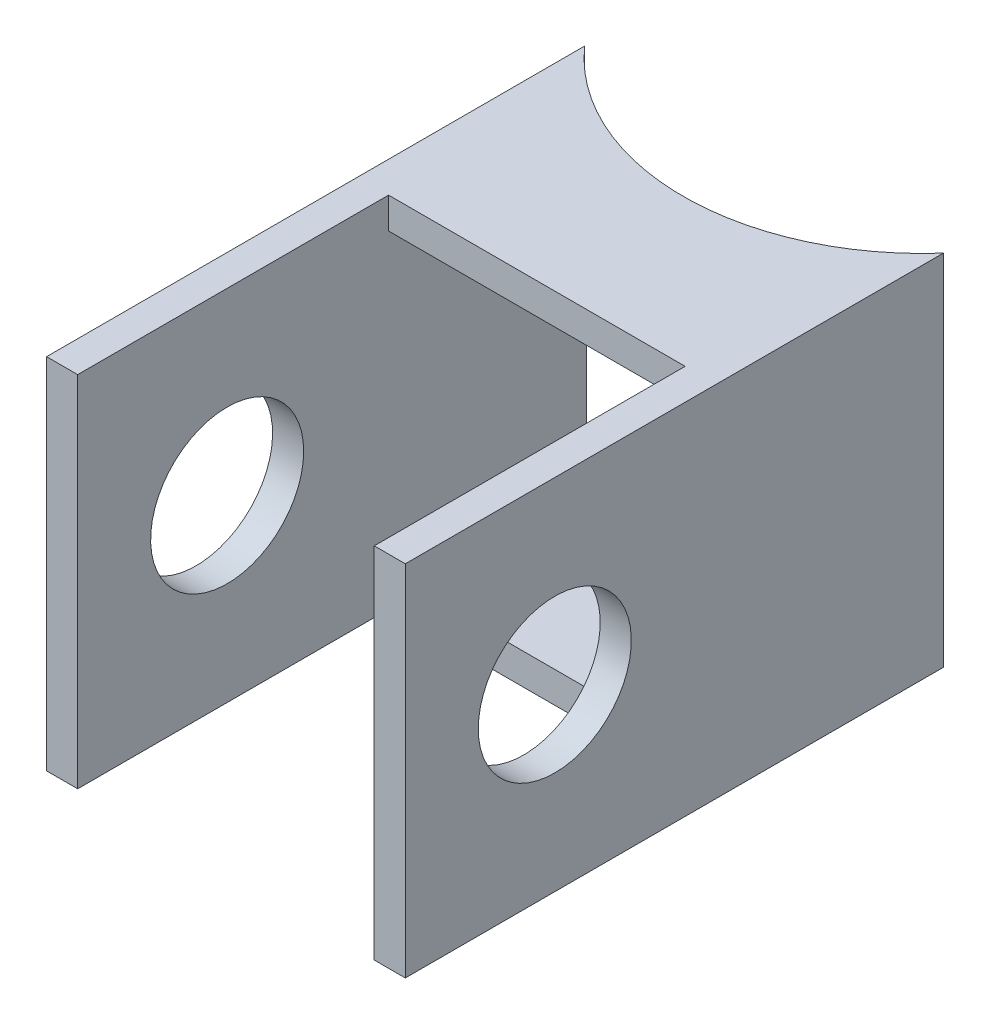
ISO-10303-21;
HEADER;
FILE_DESCRIPTION(('STEP AP214'),'2;1');
FILE_NAME('part.step','',(''),(''),'','','');
FILE_SCHEMA(('AUTOMOTIVE_DESIGN { 1 0 10303 214 1 1 1 1 }'));
ENDSEC;
DATA;
#1=APPLICATION_CONTEXT('core data for automotive mechanical design processes');
#2=APPLICATION_PROTOCOL_DEFINITION('international standard','automotive_design',2000,#1);
#3=PRODUCT_CONTEXT('',#1,'mechanical');
#4=PRODUCT('Part','Part','',(#3));
#5=PRODUCT_RELATED_PRODUCT_CATEGORY('part','',(#4));
#6=PRODUCT_DEFINITION_FORMATION('','',#4);
#7=PRODUCT_DEFINITION_CONTEXT('part definition',#1,'design');
#8=PRODUCT_DEFINITION('design','',#6,#7);
#9=PRODUCT_DEFINITION_SHAPE('','',#8);
#10=(LENGTH_UNIT() NAMED_UNIT(*) SI_UNIT(.MILLI.,.METRE.));
#11=(NAMED_UNIT(*) PLANE_ANGLE_UNIT() SI_UNIT($,.RADIAN.));
#12=(NAMED_UNIT(*) SI_UNIT($,.STERADIAN.) SOLID_ANGLE_UNIT());
#13=UNCERTAINTY_MEASURE_WITH_UNIT(LENGTH_MEASURE(1.E-05),#10,'distance_accuracy_value','');
#14=(GEOMETRIC_REPRESENTATION_CONTEXT(3) GLOBAL_UNCERTAINTY_ASSIGNED_CONTEXT((#13)) GLOBAL_UNIT_ASSIGNED_CONTEXT((#10,
#11,#12)) REPRESENTATION_CONTEXT('',''));
#15=CARTESIAN_POINT('',(0.,0.,0.));
#16=DIRECTION('',(0.,0.,1.));
#17=DIRECTION('',(1.,0.,0.));
#18=AXIS2_PLACEMENT_3D('',#15,#16,#17);
#19=CARTESIAN_POINT('',(0.,0.,28.575));
#20=DIRECTION('',(0.,0.,1.));
#21=DIRECTION('',(1.,0.,0.));
#22=AXIS2_PLACEMENT_3D('',#19,#20,#21);
#23=PLANE('',#22);
#24=DIRECTION('',(0.,-1.,0.));
#25=VECTOR('',#24,1.);
#26=CARTESIAN_POINT('',(-7.874,7.874,28.575));
#27=LINE('',#26,#25);
#28=CARTESIAN_POINT('',(-7.874,9.525,28.575));
#29=VERTEX_POINT('',#28);
#30=CARTESIAN_POINT('',(-7.874,-9.525,28.575));
#31=VERTEX_POINT('',#30);
#32=EDGE_CURVE('E195',#29,#31,#27,.T.);
#33=ORIENTED_EDGE('',*,*,#32,.F.);
#34=DIRECTION('',(-1.,0.,0.));
#35=VECTOR('',#34,1.);
#36=CARTESIAN_POINT('',(-9.525,9.525,28.575));
#37=LINE('',#36,#35);
#38=CARTESIAN_POINT('',(-9.525,9.525,28.575));
#39=VERTEX_POINT('',#38);
#40=EDGE_CURVE('E152',#29,#39,#37,.T.);
#41=ORIENTED_EDGE('',*,*,#40,.T.);
#42=DIRECTION('',(0.,-1.,0.));
#43=VECTOR('',#42,1.);
#44=CARTESIAN_POINT('',(-9.525,9.525,28.575));
#45=LINE('',#44,#43);
#46=CARTESIAN_POINT('',(-9.525,-9.525,28.575));
#47=VERTEX_POINT('',#46);
#48=EDGE_CURVE('E212',#39,#47,#45,.T.);
#49=ORIENTED_EDGE('',*,*,#48,.T.);
#50=DIRECTION('',(1.,0.,0.));
#51=VECTOR('',#50,1.);
#52=CARTESIAN_POINT('',(-9.525,-9.525,28.575));
#53=LINE('',#52,#51);
#54=EDGE_CURVE('E215',#47,#31,#53,.T.);
#55=ORIENTED_EDGE('',*,*,#54,.T.);
#56=EDGE_LOOP('',(#33,#41,#49,#55));
#57=FACE_BOUND('',#56,.T.);
#58=ADVANCED_FACE('F43',(#57),#23,.T.);
#59=DIRECTION('',(0.,1.,0.));
#60=VECTOR('',#59,1.);
#61=CARTESIAN_POINT('',(7.874,7.874,28.575));
#62=LINE('',#61,#60);
#63=CARTESIAN_POINT('',(7.874,-9.525,28.575));
#64=VERTEX_POINT('',#63);
#65=CARTESIAN_POINT('',(7.874,9.525,28.575));
#66=VERTEX_POINT('',#65);
#67=EDGE_CURVE('E193',#64,#66,#62,.T.);
#68=ORIENTED_EDGE('',*,*,#67,.F.);
#69=CARTESIAN_POINT('',(9.525,-9.525,28.575));
#70=VERTEX_POINT('',#69);
#71=EDGE_CURVE('E214',#64,#70,#53,.T.);
#72=ORIENTED_EDGE('',*,*,#71,.T.);
#73=DIRECTION('',(0.,1.,0.));
#74=VECTOR('',#73,1.);
#75=CARTESIAN_POINT('',(9.525,9.525,28.575));
#76=LINE('',#75,#74);
#77=CARTESIAN_POINT('',(9.525,9.525,28.575));
#78=VERTEX_POINT('',#77);
#79=EDGE_CURVE('E205',#70,#78,#76,.T.);
#80=ORIENTED_EDGE('',*,*,#79,.T.);
#81=EDGE_CURVE('E209',#78,#66,#37,.T.);
#82=ORIENTED_EDGE('',*,*,#81,.T.);
#83=EDGE_LOOP('',(#68,#72,#80,#82));
#84=FACE_BOUND('',#83,.T.);
#85=ADVANCED_FACE('F255',(#84),#23,.T.);
#86=CARTESIAN_POINT('',(9.525,9.525,28.575));
#87=DIRECTION('',(-1.,0.,0.));
#88=DIRECTION('',(0.,-1.,0.));
#89=AXIS2_PLACEMENT_3D('',#86,#87,#88);
#90=PLANE('',#89);
#91=CARTESIAN_POINT('',(9.525,0.,20.6375));
#92=DIRECTION('',(-1.,0.,0.));
#93=DIRECTION('',(0.,-1.,0.));
#94=AXIS2_PLACEMENT_3D('',#91,#92,#93);
#95=CIRCLE('',#94,4.064);
#96=CARTESIAN_POINT('',(9.525,-4.064,20.6375));
#97=VERTEX_POINT('',#96);
#98=EDGE_CURVE('E175',#97,#97,#95,.T.);
#99=ORIENTED_EDGE('',*,*,#98,.T.);
#100=EDGE_LOOP('',(#99));
#101=FACE_BOUND('',#100,.T.);
#102=DIRECTION('',(0.,1.,0.));
#103=VECTOR('',#102,1.);
#104=CARTESIAN_POINT('',(9.525,9.525,0.));
#105=LINE('',#104,#103);
#106=CARTESIAN_POINT('',(9.525,-9.525,0.));
#107=VERTEX_POINT('',#106);
#108=CARTESIAN_POINT('',(9.525,9.525,0.));
#109=VERTEX_POINT('',#108);
#110=EDGE_CURVE('E204',#107,#109,#105,.T.);
#111=ORIENTED_EDGE('',*,*,#110,.T.);
#112=DIRECTION('',(0.,0.,-1.));
#113=VECTOR('',#112,1.);
#114=CARTESIAN_POINT('',(9.525,9.525,28.575));
#115=LINE('',#114,#113);
#116=EDGE_CURVE('E231',#78,#109,#115,.T.);
#117=ORIENTED_EDGE('',*,*,#116,.F.);
#118=ORIENTED_EDGE('',*,*,#79,.F.);
#119=DIRECTION('',(0.,0.,-1.));
#120=VECTOR('',#119,1.);
#121=CARTESIAN_POINT('',(9.525,-9.525,28.575));
#122=LINE('',#121,#120);
#123=EDGE_CURVE('E218',#70,#107,#122,.T.);
#124=ORIENTED_EDGE('',*,*,#123,.T.);
#125=EDGE_LOOP('',(#111,#117,#118,#124));
#126=FACE_BOUND('',#125,.T.);
#127=ADVANCED_FACE('F45',(#101,#126),#90,.F.);
#128=CARTESIAN_POINT('',(-9.525,9.525,28.575));
#129=DIRECTION('',(0.,-1.,0.));
#130=DIRECTION('',(0.,0.,-1.));
#131=AXIS2_PLACEMENT_3D('',#128,#129,#130);
#132=PLANE('',#131);
#133=ORIENTED_EDGE('',*,*,#40,.F.);
#134=DIRECTION('',(0.,0.,-1.));
#135=VECTOR('',#134,1.);
#136=CARTESIAN_POINT('',(-7.874,9.525,28.575));
#137=LINE('',#136,#135);
#138=CARTESIAN_POINT('',(-7.874,9.525,12.065));
#139=VERTEX_POINT('',#138);
#140=EDGE_CURVE('E134',#29,#139,#137,.T.);
#141=ORIENTED_EDGE('',*,*,#140,.T.);
#142=DIRECTION('',(1.,0.,0.));
#143=VECTOR('',#142,1.);
#144=CARTESIAN_POINT('',(-7.874,9.525,12.065));
#145=LINE('',#144,#143);
#146=CARTESIAN_POINT('',(7.874,9.525,12.065));
#147=VERTEX_POINT('',#146);
#148=EDGE_CURVE('E141',#139,#147,#145,.T.);
#149=ORIENTED_EDGE('',*,*,#148,.T.);
#150=DIRECTION('',(0.,0.,1.));
#151=VECTOR('',#150,1.);
#152=CARTESIAN_POINT('',(7.874,9.525,28.575));
#153=LINE('',#152,#151);
#154=EDGE_CURVE('E148',#147,#66,#153,.T.);
#155=ORIENTED_EDGE('',*,*,#154,.T.);
#156=ORIENTED_EDGE('',*,*,#81,.F.);
#157=ORIENTED_EDGE('',*,*,#116,.T.);
#158=CARTESIAN_POINT('',(0.,9.525,-8.40026041263007));
#159=DIRECTION('',(0.,-1.,0.));
#160=DIRECTION('',(0.,0.,-1.));
#161=AXIS2_PLACEMENT_3D('',#158,#159,#160);
#162=CIRCLE('',#161,12.7);
#163=CARTESIAN_POINT('',(-9.525,9.525,0.));
#164=VERTEX_POINT('',#163);
#165=EDGE_CURVE('E190',#109,#164,#162,.T.);
#166=ORIENTED_EDGE('',*,*,#165,.T.);
#167=DIRECTION('',(0.,0.,-1.));
#168=VECTOR('',#167,1.);
#169=CARTESIAN_POINT('',(-9.525,9.525,28.575));
#170=LINE('',#169,#168);
#171=EDGE_CURVE('E228',#39,#164,#170,.T.);
#172=ORIENTED_EDGE('',*,*,#171,.F.);
#173=EDGE_LOOP('',(#133,#141,#149,#155,#156,#157,#166,#172));
#174=FACE_BOUND('',#173,.T.);
#175=ADVANCED_FACE('F150',(#174),#132,.F.);
#176=CARTESIAN_POINT('',(-9.525,9.525,28.575));
#177=DIRECTION('',(1.,0.,0.));
#178=DIRECTION('',(0.,1.,0.));
#179=AXIS2_PLACEMENT_3D('',#176,#177,#178);
#180=PLANE('',#179);
#181=CARTESIAN_POINT('',(-9.52500000000001,0.,20.6375));
#182=DIRECTION('',(1.,0.,0.));
#183=DIRECTION('',(0.,1.,0.));
#184=AXIS2_PLACEMENT_3D('',#181,#182,#183);
#185=CIRCLE('',#184,4.064);
#186=CARTESIAN_POINT('',(-9.52500000000001,4.064,20.6375));
#187=VERTEX_POINT('',#186);
#188=EDGE_CURVE('E168',#187,#187,#185,.T.);
#189=ORIENTED_EDGE('',*,*,#188,.T.);
#190=EDGE_LOOP('',(#189));
#191=FACE_BOUND('',#190,.T.);
#192=DIRECTION('',(0.,-1.,0.));
#193=VECTOR('',#192,1.);
#194=CARTESIAN_POINT('',(-9.525,9.525,0.));
#195=LINE('',#194,#193);
#196=CARTESIAN_POINT('',(-9.525,-9.525,0.));
#197=VERTEX_POINT('',#196);
#198=EDGE_CURVE('E208',#164,#197,#195,.T.);
#199=ORIENTED_EDGE('',*,*,#198,.T.);
#200=DIRECTION('',(0.,0.,-1.));
#201=VECTOR('',#200,1.);
#202=CARTESIAN_POINT('',(-9.525,-9.525,28.575));
#203=LINE('',#202,#201);
#204=EDGE_CURVE('E225',#47,#197,#203,.T.);
#205=ORIENTED_EDGE('',*,*,#204,.F.);
#206=ORIENTED_EDGE('',*,*,#48,.F.);
#207=ORIENTED_EDGE('',*,*,#171,.T.);
#208=EDGE_LOOP('',(#199,#205,#206,#207));
#209=FACE_BOUND('',#208,.T.);
#210=ADVANCED_FACE('F268',(#191,#209),#180,.F.);
#211=CARTESIAN_POINT('',(-9.525,-9.525,28.575));
#212=DIRECTION('',(0.,1.,0.));
#213=DIRECTION('',(0.,0.,1.));
#214=AXIS2_PLACEMENT_3D('',#211,#212,#213);
#215=PLANE('',#214);
#216=DIRECTION('',(-1.,0.,0.));
#217=VECTOR('',#216,1.);
#218=CARTESIAN_POINT('',(-9.525,-9.525,12.065));
#219=LINE('',#218,#217);
#220=CARTESIAN_POINT('',(7.874,-9.525,12.065));
#221=VERTEX_POINT('',#220);
#222=CARTESIAN_POINT('',(-7.874,-9.525,12.065));
#223=VERTEX_POINT('',#222);
#224=EDGE_CURVE('E165',#221,#223,#219,.T.);
#225=ORIENTED_EDGE('',*,*,#224,.T.);
#226=DIRECTION('',(0.,0.,1.));
#227=VECTOR('',#226,1.);
#228=CARTESIAN_POINT('',(-7.874,-9.525,28.575));
#229=LINE('',#228,#227);
#230=EDGE_CURVE('E160',#223,#31,#229,.T.);
#231=ORIENTED_EDGE('',*,*,#230,.T.);
#232=ORIENTED_EDGE('',*,*,#54,.F.);
#233=ORIENTED_EDGE('',*,*,#204,.T.);
#234=CARTESIAN_POINT('',(0.,-9.525,-8.40026041263007));
#235=DIRECTION('',(0.,1.,0.));
#236=DIRECTION('',(0.,0.,1.));
#237=AXIS2_PLACEMENT_3D('',#234,#235,#236);
#238=CIRCLE('',#237,12.7);
#239=EDGE_CURVE('E178',#197,#107,#238,.T.);
#240=ORIENTED_EDGE('',*,*,#239,.T.);
#241=ORIENTED_EDGE('',*,*,#123,.F.);
#242=ORIENTED_EDGE('',*,*,#71,.F.);
#243=DIRECTION('',(0.,0.,-1.));
#244=VECTOR('',#243,1.);
#245=CARTESIAN_POINT('',(7.874,-9.525,28.575));
#246=LINE('',#245,#244);
#247=EDGE_CURVE('E156',#64,#221,#246,.T.);
#248=ORIENTED_EDGE('',*,*,#247,.T.);
#249=EDGE_LOOP('',(#225,#231,#232,#233,#240,#241,#242,#248));
#250=FACE_BOUND('',#249,.T.);
#251=ADVANCED_FACE('F265',(#250),#215,.F.);
#252=CARTESIAN_POINT('',(7.874,7.874,28.575));
#253=DIRECTION('',(-1.,0.,0.));
#254=DIRECTION('',(0.,0.,1.));
#255=AXIS2_PLACEMENT_3D('',#252,#253,#254);
#256=PLANE('',#255);
#257=DIRECTION('',(0.,0.,-1.));
#258=VECTOR('',#257,1.);
#259=CARTESIAN_POINT('',(7.874,-7.874,28.575));
#260=LINE('',#259,#258);
#261=CARTESIAN_POINT('',(7.874,-7.874,12.065));
#262=VERTEX_POINT('',#261);
#263=CARTESIAN_POINT('',(7.874,-7.874,1.5641825723039));
#264=VERTEX_POINT('',#263);
#265=EDGE_CURVE('E197',#262,#264,#260,.T.);
#266=ORIENTED_EDGE('',*,*,#265,.F.);
#267=DIRECTION('',(0.,-1.,0.));
#268=VECTOR('',#267,1.);
#269=CARTESIAN_POINT('',(7.874,9.525,12.065));
#270=LINE('',#269,#268);
#271=EDGE_CURVE('E65',#262,#221,#270,.T.);
#272=ORIENTED_EDGE('',*,*,#271,.T.);
#273=ORIENTED_EDGE('',*,*,#247,.F.);
#274=ORIENTED_EDGE('',*,*,#67,.T.);
#275=ORIENTED_EDGE('',*,*,#154,.F.);
#276=CARTESIAN_POINT('',(7.874,7.874,12.065));
#277=VERTEX_POINT('',#276);
#278=EDGE_CURVE('E144',#147,#277,#270,.T.);
#279=ORIENTED_EDGE('',*,*,#278,.T.);
#280=DIRECTION('',(0.,0.,-1.));
#281=VECTOR('',#280,1.);
#282=CARTESIAN_POINT('',(7.874,7.874,28.575));
#283=LINE('',#282,#281);
#284=CARTESIAN_POINT('',(7.874,7.874,1.5641825723039));
#285=VERTEX_POINT('',#284);
#286=EDGE_CURVE('E202',#277,#285,#283,.T.);
#287=ORIENTED_EDGE('',*,*,#286,.T.);
#288=DIRECTION('',(0.,1.,0.));
#289=VECTOR('',#288,1.);
#290=CARTESIAN_POINT('',(7.874,-9.525,1.5641825723039));
#291=LINE('',#290,#289);
#292=EDGE_CURVE('E187',#264,#285,#291,.T.);
#293=ORIENTED_EDGE('',*,*,#292,.F.);
#294=EDGE_LOOP('',(#266,#272,#273,#274,#275,#279,#287,#293));
#295=FACE_BOUND('',#294,.T.);
#296=CARTESIAN_POINT('',(7.874,0.,20.6375));
#297=DIRECTION('',(-1.,0.,0.));
#298=DIRECTION('',(0.,0.,1.));
#299=AXIS2_PLACEMENT_3D('',#296,#297,#298);
#300=CIRCLE('',#299,4.064);
#301=CARTESIAN_POINT('',(7.874,0.,24.7015));
#302=VERTEX_POINT('',#301);
#303=EDGE_CURVE('E172',#302,#302,#300,.T.);
#304=ORIENTED_EDGE('',*,*,#303,.F.);
#305=EDGE_LOOP('',(#304));
#306=FACE_BOUND('',#305,.T.);
#307=ADVANCED_FACE('F251',(#295,#306),#256,.T.);
#308=CARTESIAN_POINT('',(-7.874,7.874,28.575));
#309=DIRECTION('',(0.,-1.,0.));
#310=DIRECTION('',(0.,0.,-1.));
#311=AXIS2_PLACEMENT_3D('',#308,#309,#310);
#312=PLANE('',#311);
#313=DIRECTION('',(1.,0.,0.));
#314=VECTOR('',#313,1.);
#315=CARTESIAN_POINT('',(-7.874,7.874,12.065));
#316=LINE('',#315,#314);
#317=CARTESIAN_POINT('',(-7.874,7.874,12.065));
#318=VERTEX_POINT('',#317);
#319=EDGE_CURVE('E163',#318,#277,#316,.T.);
#320=ORIENTED_EDGE('',*,*,#319,.F.);
#321=DIRECTION('',(0.,0.,-1.));
#322=VECTOR('',#321,1.);
#323=CARTESIAN_POINT('',(-7.874,7.874,28.575));
#324=LINE('',#323,#322);
#325=CARTESIAN_POINT('',(-7.874,7.874,1.5641825723039));
#326=VERTEX_POINT('',#325);
#327=EDGE_CURVE('E137',#318,#326,#324,.T.);
#328=ORIENTED_EDGE('',*,*,#327,.T.);
#329=CARTESIAN_POINT('',(0.,7.874,-8.40026041263007));
#330=DIRECTION('',(0.,-1.,0.));
#331=DIRECTION('',(0.,0.,-1.));
#332=AXIS2_PLACEMENT_3D('',#329,#330,#331);
#333=CIRCLE('',#332,12.7);
#334=EDGE_CURVE('E184',#285,#326,#333,.T.);
#335=ORIENTED_EDGE('',*,*,#334,.F.);
#336=ORIENTED_EDGE('',*,*,#286,.F.);
#337=EDGE_LOOP('',(#320,#328,#335,#336));
#338=FACE_BOUND('',#337,.T.);
#339=ADVANCED_FACE('F242',(#338),#312,.T.);
#340=CARTESIAN_POINT('',(-7.874,7.874,28.575));
#341=DIRECTION('',(1.,0.,0.));
#342=DIRECTION('',(0.,0.,-1.));
#343=AXIS2_PLACEMENT_3D('',#340,#341,#342);
#344=PLANE('',#343);
#345=ORIENTED_EDGE('',*,*,#327,.F.);
#346=DIRECTION('',(0.,-1.,0.));
#347=VECTOR('',#346,1.);
#348=CARTESIAN_POINT('',(-7.874,9.525,12.065));
#349=LINE('',#348,#347);
#350=EDGE_CURVE('E58',#139,#318,#349,.T.);
#351=ORIENTED_EDGE('',*,*,#350,.F.);
#352=ORIENTED_EDGE('',*,*,#140,.F.);
#353=ORIENTED_EDGE('',*,*,#32,.T.);
#354=ORIENTED_EDGE('',*,*,#230,.F.);
#355=CARTESIAN_POINT('',(-7.874,-7.874,12.065));
#356=VERTEX_POINT('',#355);
#357=EDGE_CURVE('E138',#356,#223,#349,.T.);
#358=ORIENTED_EDGE('',*,*,#357,.F.);
#359=DIRECTION('',(0.,0.,-1.));
#360=VECTOR('',#359,1.);
#361=CARTESIAN_POINT('',(-7.874,-7.874,28.575));
#362=LINE('',#361,#360);
#363=CARTESIAN_POINT('',(-7.874,-7.874,1.5641825723039));
#364=VERTEX_POINT('',#363);
#365=EDGE_CURVE('E199',#356,#364,#362,.T.);
#366=ORIENTED_EDGE('',*,*,#365,.T.);
#367=DIRECTION('',(0.,1.,0.));
#368=VECTOR('',#367,1.);
#369=CARTESIAN_POINT('',(-7.874,-9.525,1.5641825723039));
#370=LINE('',#369,#368);
#371=EDGE_CURVE('E181',#326,#364,#370,.F.);
#372=ORIENTED_EDGE('',*,*,#371,.F.);
#373=EDGE_LOOP('',(#345,#351,#352,#353,#354,#358,#366,#372));
#374=FACE_BOUND('',#373,.T.);
#375=CARTESIAN_POINT('',(-7.874,0.,20.6375));
#376=DIRECTION('',(1.,0.,0.));
#377=DIRECTION('',(0.,0.,-1.));
#378=AXIS2_PLACEMENT_3D('',#375,#376,#377);
#379=CIRCLE('',#378,4.064);
#380=CARTESIAN_POINT('',(-7.874,0.,16.5735));
#381=VERTEX_POINT('',#380);
#382=EDGE_CURVE('E171',#381,#381,#379,.T.);
#383=ORIENTED_EDGE('',*,*,#382,.F.);
#384=EDGE_LOOP('',(#383));
#385=FACE_BOUND('',#384,.T.);
#386=ADVANCED_FACE('F131',(#374,#385),#344,.T.);
#387=CARTESIAN_POINT('',(-7.874,-7.874,28.575));
#388=DIRECTION('',(0.,1.,0.));
#389=DIRECTION('',(0.,0.,1.));
#390=AXIS2_PLACEMENT_3D('',#387,#388,#389);
#391=PLANE('',#390);
#392=DIRECTION('',(-1.,0.,0.));
#393=VECTOR('',#392,1.);
#394=CARTESIAN_POINT('',(-7.874,-7.874,12.065));
#395=LINE('',#394,#393);
#396=EDGE_CURVE('E11',#262,#356,#395,.T.);
#397=ORIENTED_EDGE('',*,*,#396,.F.);
#398=ORIENTED_EDGE('',*,*,#265,.T.);
#399=CARTESIAN_POINT('',(0.,-7.874,-8.40026041263007));
#400=DIRECTION('',(0.,1.,0.));
#401=DIRECTION('',(0.,0.,1.));
#402=AXIS2_PLACEMENT_3D('',#399,#400,#401);
#403=CIRCLE('',#402,12.7);
#404=EDGE_CURVE('E51',#364,#264,#403,.T.);
#405=ORIENTED_EDGE('',*,*,#404,.F.);
#406=ORIENTED_EDGE('',*,*,#365,.F.);
#407=EDGE_LOOP('',(#397,#398,#405,#406));
#408=FACE_BOUND('',#407,.T.);
#409=ADVANCED_FACE('F241',(#408),#391,.T.);
#410=CARTESIAN_POINT('',(0.,-9.525,-8.40026041263007));
#411=DIRECTION('',(0.,1.,0.));
#412=DIRECTION('',(0.,0.,1.));
#413=AXIS2_PLACEMENT_3D('',#410,#411,#412);
#414=CYLINDRICAL_SURFACE('',#413,12.7);
#415=ORIENTED_EDGE('',*,*,#292,.T.);
#416=ORIENTED_EDGE('',*,*,#334,.T.);
#417=ORIENTED_EDGE('',*,*,#371,.T.);
#418=ORIENTED_EDGE('',*,*,#404,.T.);
#419=EDGE_LOOP('',(#415,#416,#417,#418));
#420=FACE_BOUND('',#419,.T.);
#421=ORIENTED_EDGE('',*,*,#239,.F.);
#422=ORIENTED_EDGE('',*,*,#198,.F.);
#423=ORIENTED_EDGE('',*,*,#165,.F.);
#424=ORIENTED_EDGE('',*,*,#110,.F.);
#425=EDGE_LOOP('',(#421,#422,#423,#424));
#426=FACE_BOUND('',#425,.T.);
#427=ADVANCED_FACE('F248',(#420,#426),#414,.F.);
#428=CARTESIAN_POINT('',(-9.52500000000001,0.,20.6375));
#429=DIRECTION('',(1.,0.,0.));
#430=DIRECTION('',(0.,1.,0.));
#431=AXIS2_PLACEMENT_3D('',#428,#429,#430);
#432=CYLINDRICAL_SURFACE('',#431,4.064);
#433=ORIENTED_EDGE('',*,*,#382,.T.);
#434=EDGE_LOOP('',(#433));
#435=FACE_BOUND('',#434,.T.);
#436=ORIENTED_EDGE('',*,*,#188,.F.);
#437=EDGE_LOOP('',(#436));
#438=FACE_BOUND('',#437,.T.);
#439=ADVANCED_FACE('F238',(#435,#438),#432,.F.);
#440=ORIENTED_EDGE('',*,*,#303,.T.);
#441=EDGE_LOOP('',(#440));
#442=FACE_BOUND('',#441,.T.);
#443=ORIENTED_EDGE('',*,*,#98,.F.);
#444=EDGE_LOOP('',(#443));
#445=FACE_BOUND('',#444,.T.);
#446=ADVANCED_FACE('F304',(#442,#445),#432,.F.);
#447=CARTESIAN_POINT('',(-7.874,9.525,12.065));
#448=DIRECTION('',(0.,0.,-1.));
#449=DIRECTION('',(-1.,0.,0.));
#450=AXIS2_PLACEMENT_3D('',#447,#448,#449);
#451=PLANE('',#450);
#452=ORIENTED_EDGE('',*,*,#271,.F.);
#453=ORIENTED_EDGE('',*,*,#396,.T.);
#454=ORIENTED_EDGE('',*,*,#357,.T.);
#455=ORIENTED_EDGE('',*,*,#224,.F.);
#456=EDGE_LOOP('',(#452,#453,#454,#455));
#457=FACE_BOUND('',#456,.T.);
#458=ADVANCED_FACE('F302',(#457),#451,.F.);
#459=ORIENTED_EDGE('',*,*,#319,.T.);
#460=ORIENTED_EDGE('',*,*,#278,.F.);
#461=ORIENTED_EDGE('',*,*,#148,.F.);
#462=ORIENTED_EDGE('',*,*,#350,.T.);
#463=EDGE_LOOP('',(#459,#460,#461,#462));
#464=FACE_BOUND('',#463,.T.);
#465=ADVANCED_FACE('F142',(#464),#451,.F.);
#466=CLOSED_SHELL('',(#58,#85,#127,#175,#210,#251,#307,#339,#386,#409,#427,#439,#446,#458,#465));
#467=MANIFOLD_SOLID_BREP('B2',#466);
#468=ADVANCED_BREP_SHAPE_REPRESENTATION('',(#18,#467),#14);
#469=SHAPE_DEFINITION_REPRESENTATION(#9,#468);
ENDSEC;
END-ISO-10303-21;
